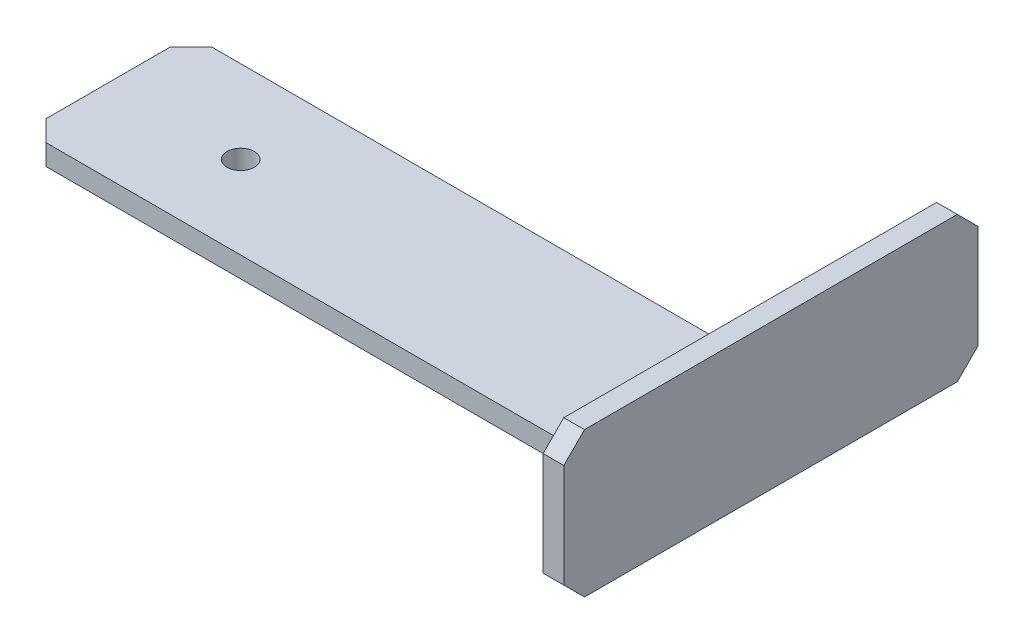
ISO-10303-21;
HEADER;
FILE_DESCRIPTION(('STEP AP214'),'2;1');
FILE_NAME('part.step','',(''),(''),'','','');
FILE_SCHEMA(('AUTOMOTIVE_DESIGN { 1 0 10303 214 1 1 1 1 }'));
ENDSEC;
DATA;
#1=APPLICATION_CONTEXT('core data for automotive mechanical design processes');
#2=APPLICATION_PROTOCOL_DEFINITION('international standard','automotive_design',2000,#1);
#3=PRODUCT_CONTEXT('',#1,'mechanical');
#4=PRODUCT('Part','Part','',(#3));
#5=PRODUCT_RELATED_PRODUCT_CATEGORY('part','',(#4));
#6=PRODUCT_DEFINITION_FORMATION('','',#4);
#7=PRODUCT_DEFINITION_CONTEXT('part definition',#1,'design');
#8=PRODUCT_DEFINITION('design','',#6,#7);
#9=PRODUCT_DEFINITION_SHAPE('','',#8);
#10=(LENGTH_UNIT() NAMED_UNIT(*) SI_UNIT(.MILLI.,.METRE.));
#11=(NAMED_UNIT(*) PLANE_ANGLE_UNIT() SI_UNIT($,.RADIAN.));
#12=(NAMED_UNIT(*) SI_UNIT($,.STERADIAN.) SOLID_ANGLE_UNIT());
#13=UNCERTAINTY_MEASURE_WITH_UNIT(LENGTH_MEASURE(1.E-05),#10,'distance_accuracy_value','');
#14=(GEOMETRIC_REPRESENTATION_CONTEXT(3) GLOBAL_UNCERTAINTY_ASSIGNED_CONTEXT((#13)) GLOBAL_UNIT_ASSIGNED_CONTEXT((#10,
#11,#12)) REPRESENTATION_CONTEXT('',''));
#15=CARTESIAN_POINT('',(0.,0.,0.));
#16=DIRECTION('',(0.,0.,1.));
#17=DIRECTION('',(1.,0.,0.));
#18=AXIS2_PLACEMENT_3D('',#15,#16,#17);
#19=CARTESIAN_POINT('',(0.,5.,0.));
#20=DIRECTION('',(0.,-1.,0.));
#21=DIRECTION('',(0.,0.,-1.));
#22=AXIS2_PLACEMENT_3D('',#19,#20,#21);
#23=PLANE('',#22);
#24=DIRECTION('',(-1.,0.,0.));
#25=VECTOR('',#24,1.);
#26=CARTESIAN_POINT('',(0.,5.,-40.));
#27=LINE('',#26,#25);
#28=CARTESIAN_POINT('',(150.,5.,-40.));
#29=VERTEX_POINT('',#28);
#30=CARTESIAN_POINT('',(5.00000000000006,5.,-40.));
#31=VERTEX_POINT('',#30);
#32=EDGE_CURVE('E173',#29,#31,#27,.T.);
#33=ORIENTED_EDGE('',*,*,#32,.T.);
#34=DIRECTION('',(0.707106781186549,0.,-0.707106781186546));
#35=VECTOR('',#34,1.);
#36=CARTESIAN_POINT('',(0.,5.,-35.));
#37=LINE('',#36,#35);
#38=CARTESIAN_POINT('',(0.,5.,-35.));
#39=VERTEX_POINT('',#38);
#40=EDGE_CURVE('E239',#31,#39,#37,.F.);
#41=ORIENTED_EDGE('',*,*,#40,.T.);
#42=DIRECTION('',(0.,0.,1.));
#43=VECTOR('',#42,1.);
#44=CARTESIAN_POINT('',(0.,5.,0.));
#45=LINE('',#44,#43);
#46=CARTESIAN_POINT('',(0.,5.,-5.00000000000003));
#47=VERTEX_POINT('',#46);
#48=EDGE_CURVE('E181',#39,#47,#45,.T.);
#49=ORIENTED_EDGE('',*,*,#48,.T.);
#50=DIRECTION('',(-0.707106781186548,0.,-0.707106781186548));
#51=VECTOR('',#50,1.);
#52=CARTESIAN_POINT('',(5.00000000000003,5.,0.));
#53=LINE('',#52,#51);
#54=CARTESIAN_POINT('',(5.00000000000003,5.,0.));
#55=VERTEX_POINT('',#54);
#56=EDGE_CURVE('E63',#47,#55,#53,.F.);
#57=ORIENTED_EDGE('',*,*,#56,.T.);
#58=DIRECTION('',(1.,0.,0.));
#59=VECTOR('',#58,1.);
#60=CARTESIAN_POINT('',(0.,5.,0.));
#61=LINE('',#60,#59);
#62=CARTESIAN_POINT('',(150.,5.,0.));
#63=VERTEX_POINT('',#62);
#64=EDGE_CURVE('E184',#55,#63,#61,.T.);
#65=ORIENTED_EDGE('',*,*,#64,.T.);
#66=DIRECTION('',(0.707106781186553,0.,0.707106781186542));
#67=VECTOR('',#66,1.);
#68=CARTESIAN_POINT('',(74.9999999999987,5.,-75.));
#69=LINE('',#68,#67);
#70=CARTESIAN_POINT('',(155.,5.,4.99999999999998));
#71=VERTEX_POINT('',#70);
#72=EDGE_CURVE('E55',#63,#71,#69,.T.);
#73=ORIENTED_EDGE('',*,*,#72,.T.);
#74=DIRECTION('',(0.,0.,-1.));
#75=VECTOR('',#74,1.);
#76=CARTESIAN_POINT('',(155.,5.,0.));
#77=LINE('',#76,#75);
#78=CARTESIAN_POINT('',(155.,5.,-44.9999999999999));
#79=VERTEX_POINT('',#78);
#80=EDGE_CURVE('E348',#71,#79,#77,.T.);
#81=ORIENTED_EDGE('',*,*,#80,.T.);
#82=DIRECTION('',(-0.707106781186551,0.,0.707106781186544));
#83=VECTOR('',#82,1.);
#84=CARTESIAN_POINT('',(54.9999999999992,5.,54.9999999999998));
#85=LINE('',#84,#83);
#86=EDGE_CURVE('E11',#79,#29,#85,.T.);
#87=ORIENTED_EDGE('',*,*,#86,.T.);
#88=EDGE_LOOP('',(#33,#41,#49,#57,#65,#73,#81,#87));
#89=FACE_BOUND('',#88,.T.);
#90=CARTESIAN_POINT('',(32.,5.,-20.));
#91=DIRECTION('',(0.,1.,0.));
#92=DIRECTION('',(0.,0.,1.));
#93=AXIS2_PLACEMENT_3D('',#90,#91,#92);
#94=CIRCLE('',#93,3.302);
#95=CARTESIAN_POINT('',(32.,5.,-16.698));
#96=VERTEX_POINT('',#95);
#97=EDGE_CURVE('E339',#96,#96,#94,.T.);
#98=ORIENTED_EDGE('',*,*,#97,.F.);
#99=EDGE_LOOP('',(#98));
#100=FACE_BOUND('',#99,.T.);
#101=ADVANCED_FACE('F39',(#89,#100),#23,.F.);
#102=CARTESIAN_POINT('',(0.,0.,0.));
#103=DIRECTION('',(0.,-1.,0.));
#104=DIRECTION('',(0.,0.,-1.));
#105=AXIS2_PLACEMENT_3D('',#102,#103,#104);
#106=PLANE('',#105);
#107=DIRECTION('',(0.,0.,-1.));
#108=VECTOR('',#107,1.);
#109=CARTESIAN_POINT('',(155.,0.,-70.));
#110=LINE('',#109,#108);
#111=CARTESIAN_POINT('',(155.,0.,-44.9999999999999));
#112=VERTEX_POINT('',#111);
#113=CARTESIAN_POINT('',(155.,0.,-65.));
#114=VERTEX_POINT('',#113);
#115=EDGE_CURVE('E366',#112,#114,#110,.T.);
#116=ORIENTED_EDGE('',*,*,#115,.T.);
#117=DIRECTION('',(1.,0.,0.));
#118=VECTOR('',#117,1.);
#119=CARTESIAN_POINT('',(0.,0.,-65.));
#120=LINE('',#119,#118);
#121=CARTESIAN_POINT('',(160.,0.,-65.));
#122=VERTEX_POINT('',#121);
#123=EDGE_CURVE('E197',#114,#122,#120,.T.);
#124=ORIENTED_EDGE('',*,*,#123,.T.);
#125=DIRECTION('',(0.,0.,-1.));
#126=VECTOR('',#125,1.);
#127=CARTESIAN_POINT('',(160.,0.,0.));
#128=LINE('',#127,#126);
#129=CARTESIAN_POINT('',(160.,0.,25.));
#130=VERTEX_POINT('',#129);
#131=EDGE_CURVE('E182',#130,#122,#128,.T.);
#132=ORIENTED_EDGE('',*,*,#131,.F.);
#133=DIRECTION('',(-1.,0.,0.));
#134=VECTOR('',#133,1.);
#135=CARTESIAN_POINT('',(0.,0.,25.));
#136=LINE('',#135,#134);
#137=CARTESIAN_POINT('',(155.,0.,25.));
#138=VERTEX_POINT('',#137);
#139=EDGE_CURVE('E194',#130,#138,#136,.T.);
#140=ORIENTED_EDGE('',*,*,#139,.T.);
#141=CARTESIAN_POINT('',(155.,0.,4.99999999999998));
#142=VERTEX_POINT('',#141);
#143=EDGE_CURVE('E252',#138,#142,#110,.T.);
#144=ORIENTED_EDGE('',*,*,#143,.T.);
#145=DIRECTION('',(-0.707106781186553,0.,-0.707106781186542));
#146=VECTOR('',#145,1.);
#147=CARTESIAN_POINT('',(150.,0.,0.));
#148=LINE('',#147,#146);
#149=CARTESIAN_POINT('',(150.,0.,0.));
#150=VERTEX_POINT('',#149);
#151=EDGE_CURVE('E165',#142,#150,#148,.T.);
#152=ORIENTED_EDGE('',*,*,#151,.T.);
#153=DIRECTION('',(1.,0.,0.));
#154=VECTOR('',#153,1.);
#155=CARTESIAN_POINT('',(0.,0.,0.));
#156=LINE('',#155,#154);
#157=CARTESIAN_POINT('',(5.00000000000003,0.,0.));
#158=VERTEX_POINT('',#157);
#159=EDGE_CURVE('E187',#158,#150,#156,.T.);
#160=ORIENTED_EDGE('',*,*,#159,.F.);
#161=DIRECTION('',(0.707106781186548,0.,0.707106781186548));
#162=VECTOR('',#161,1.);
#163=CARTESIAN_POINT('',(2.50000000000002,0.,-2.50000000000002));
#164=LINE('',#163,#162);
#165=CARTESIAN_POINT('',(0.,0.,-5.00000000000003));
#166=VERTEX_POINT('',#165);
#167=EDGE_CURVE('E191',#158,#166,#164,.F.);
#168=ORIENTED_EDGE('',*,*,#167,.T.);
#169=DIRECTION('',(0.,0.,1.));
#170=VECTOR('',#169,1.);
#171=CARTESIAN_POINT('',(0.,0.,0.));
#172=LINE('',#171,#170);
#173=CARTESIAN_POINT('',(0.,0.,-35.));
#174=VERTEX_POINT('',#173);
#175=EDGE_CURVE('E256',#174,#166,#172,.T.);
#176=ORIENTED_EDGE('',*,*,#175,.F.);
#177=DIRECTION('',(-0.707106781186549,0.,0.707106781186546));
#178=VECTOR('',#177,1.);
#179=CARTESIAN_POINT('',(-17.5,0.,-17.5000000000001));
#180=LINE('',#179,#178);
#181=CARTESIAN_POINT('',(5.00000000000006,0.,-40.));
#182=VERTEX_POINT('',#181);
#183=EDGE_CURVE('E180',#174,#182,#180,.F.);
#184=ORIENTED_EDGE('',*,*,#183,.T.);
#185=DIRECTION('',(-1.,0.,0.));
#186=VECTOR('',#185,1.);
#187=CARTESIAN_POINT('',(0.,0.,-40.));
#188=LINE('',#187,#186);
#189=CARTESIAN_POINT('',(150.,0.,-40.));
#190=VERTEX_POINT('',#189);
#191=EDGE_CURVE('E170',#190,#182,#188,.T.);
#192=ORIENTED_EDGE('',*,*,#191,.F.);
#193=DIRECTION('',(0.707106781186551,0.,-0.707106781186544));
#194=VECTOR('',#193,1.);
#195=CARTESIAN_POINT('',(150.,0.,-40.));
#196=LINE('',#195,#194);
#197=EDGE_CURVE('E48',#190,#112,#196,.T.);
#198=ORIENTED_EDGE('',*,*,#197,.T.);
#199=EDGE_LOOP('',(#116,#124,#132,#140,#144,#152,#160,#168,#176,#184,#192,#198));
#200=FACE_BOUND('',#199,.T.);
#201=CARTESIAN_POINT('',(32.,0.,-20.));
#202=DIRECTION('',(0.,1.,0.));
#203=DIRECTION('',(0.,0.,1.));
#204=AXIS2_PLACEMENT_3D('',#201,#202,#203);
#205=CIRCLE('',#204,3.302);
#206=CARTESIAN_POINT('',(32.,0.,-16.698));
#207=VERTEX_POINT('',#206);
#208=EDGE_CURVE('E342',#207,#207,#205,.T.);
#209=ORIENTED_EDGE('',*,*,#208,.T.);
#210=EDGE_LOOP('',(#209));
#211=FACE_BOUND('',#210,.T.);
#212=ADVANCED_FACE('F177',(#200,#211),#106,.T.);
#213=CARTESIAN_POINT('',(0.,5.,0.));
#214=DIRECTION('',(1.,0.,0.));
#215=DIRECTION('',(0.,0.,-1.));
#216=AXIS2_PLACEMENT_3D('',#213,#214,#215);
#217=PLANE('',#216);
#218=ORIENTED_EDGE('',*,*,#48,.F.);
#219=DIRECTION('',(0.,-1.,0.));
#220=VECTOR('',#219,1.);
#221=CARTESIAN_POINT('',(0.,5.,-35.));
#222=LINE('',#221,#220);
#223=EDGE_CURVE('E175',#39,#174,#222,.T.);
#224=ORIENTED_EDGE('',*,*,#223,.T.);
#225=ORIENTED_EDGE('',*,*,#175,.T.);
#226=DIRECTION('',(0.,1.,0.));
#227=VECTOR('',#226,1.);
#228=CARTESIAN_POINT('',(0.,5.,-5.00000000000003));
#229=LINE('',#228,#227);
#230=EDGE_CURVE('E233',#166,#47,#229,.T.);
#231=ORIENTED_EDGE('',*,*,#230,.T.);
#232=EDGE_LOOP('',(#218,#224,#225,#231));
#233=FACE_BOUND('',#232,.T.);
#234=ADVANCED_FACE('F273',(#233),#217,.F.);
#235=CARTESIAN_POINT('',(0.,5.,0.));
#236=DIRECTION('',(0.,0.,-1.));
#237=DIRECTION('',(-1.,0.,0.));
#238=AXIS2_PLACEMENT_3D('',#235,#236,#237);
#239=PLANE('',#238);
#240=ORIENTED_EDGE('',*,*,#64,.F.);
#241=DIRECTION('',(0.,-1.,0.));
#242=VECTOR('',#241,1.);
#243=CARTESIAN_POINT('',(5.00000000000003,5.,0.));
#244=LINE('',#243,#242);
#245=EDGE_CURVE('E243',#55,#158,#244,.T.);
#246=ORIENTED_EDGE('',*,*,#245,.T.);
#247=ORIENTED_EDGE('',*,*,#159,.T.);
#248=DIRECTION('',(0.,1.,0.));
#249=VECTOR('',#248,1.);
#250=CARTESIAN_POINT('',(150.,5.,0.));
#251=LINE('',#250,#249);
#252=EDGE_CURVE('E241',#150,#63,#251,.T.);
#253=ORIENTED_EDGE('',*,*,#252,.T.);
#254=EDGE_LOOP('',(#240,#246,#247,#253));
#255=FACE_BOUND('',#254,.T.);
#256=ADVANCED_FACE('F254',(#255),#239,.F.);
#257=CARTESIAN_POINT('',(160.,5.,0.));
#258=DIRECTION('',(-1.,0.,0.));
#259=DIRECTION('',(0.,0.,1.));
#260=AXIS2_PLACEMENT_3D('',#257,#258,#259);
#261=PLANE('',#260);
#262=ORIENTED_EDGE('',*,*,#131,.T.);
#263=DIRECTION('',(0.,-0.707106781186548,0.707106781186548));
#264=VECTOR('',#263,1.);
#265=CARTESIAN_POINT('',(160.,0.,-65.));
#266=LINE('',#265,#264);
#267=CARTESIAN_POINT('',(160.,5.,-70.));
#268=VERTEX_POINT('',#267);
#269=EDGE_CURVE('E206',#122,#268,#266,.F.);
#270=ORIENTED_EDGE('',*,*,#269,.T.);
#271=DIRECTION('',(0.,-1.,0.));
#272=VECTOR('',#271,1.);
#273=CARTESIAN_POINT('',(160.,35.,-70.));
#274=LINE('',#273,#272);
#275=CARTESIAN_POINT('',(160.,30.,-70.));
#276=VERTEX_POINT('',#275);
#277=EDGE_CURVE('E355',#276,#268,#274,.T.);
#278=ORIENTED_EDGE('',*,*,#277,.F.);
#279=DIRECTION('',(0.,-0.707106781186546,-0.707106781186549));
#280=VECTOR('',#279,1.);
#281=CARTESIAN_POINT('',(160.,30.,-70.));
#282=LINE('',#281,#280);
#283=CARTESIAN_POINT('',(160.,35.,-64.9999999999999));
#284=VERTEX_POINT('',#283);
#285=EDGE_CURVE('E200',#276,#284,#282,.F.);
#286=ORIENTED_EDGE('',*,*,#285,.T.);
#287=DIRECTION('',(0.,0.,1.));
#288=VECTOR('',#287,1.);
#289=CARTESIAN_POINT('',(160.,35.,-70.));
#290=LINE('',#289,#288);
#291=CARTESIAN_POINT('',(160.,35.,24.9999999999999));
#292=VERTEX_POINT('',#291);
#293=EDGE_CURVE('E356',#284,#292,#290,.T.);
#294=ORIENTED_EDGE('',*,*,#293,.T.);
#295=DIRECTION('',(0.,0.707106781186546,-0.707106781186549));
#296=VECTOR('',#295,1.);
#297=CARTESIAN_POINT('',(160.,30.,30.));
#298=LINE('',#297,#296);
#299=CARTESIAN_POINT('',(160.,30.,30.));
#300=VERTEX_POINT('',#299);
#301=EDGE_CURVE('E202',#292,#300,#298,.F.);
#302=ORIENTED_EDGE('',*,*,#301,.T.);
#303=DIRECTION('',(0.,-1.,0.));
#304=VECTOR('',#303,1.);
#305=CARTESIAN_POINT('',(160.,35.,30.));
#306=LINE('',#305,#304);
#307=CARTESIAN_POINT('',(160.,5.00000000000003,30.));
#308=VERTEX_POINT('',#307);
#309=EDGE_CURVE('E359',#300,#308,#306,.T.);
#310=ORIENTED_EDGE('',*,*,#309,.T.);
#311=DIRECTION('',(0.,0.707106781186548,0.707106781186548));
#312=VECTOR('',#311,1.);
#313=CARTESIAN_POINT('',(160.,0.,25.));
#314=LINE('',#313,#312);
#315=EDGE_CURVE('E204',#308,#130,#314,.F.);
#316=ORIENTED_EDGE('',*,*,#315,.T.);
#317=EDGE_LOOP('',(#262,#270,#278,#286,#294,#302,#310,#316));
#318=FACE_BOUND('',#317,.T.);
#319=ADVANCED_FACE('F282',(#318),#261,.F.);
#320=CARTESIAN_POINT('',(0.,5.,-40.));
#321=DIRECTION('',(0.,0.,1.));
#322=DIRECTION('',(1.,0.,0.));
#323=AXIS2_PLACEMENT_3D('',#320,#321,#322);
#324=PLANE('',#323);
#325=ORIENTED_EDGE('',*,*,#191,.T.);
#326=DIRECTION('',(0.,1.,0.));
#327=VECTOR('',#326,1.);
#328=CARTESIAN_POINT('',(5.00000000000006,5.,-40.));
#329=LINE('',#328,#327);
#330=EDGE_CURVE('E174',#182,#31,#329,.T.);
#331=ORIENTED_EDGE('',*,*,#330,.T.);
#332=ORIENTED_EDGE('',*,*,#32,.F.);
#333=DIRECTION('',(0.,-1.,0.));
#334=VECTOR('',#333,1.);
#335=CARTESIAN_POINT('',(150.,5.,-40.));
#336=LINE('',#335,#334);
#337=EDGE_CURVE('E158',#29,#190,#336,.T.);
#338=ORIENTED_EDGE('',*,*,#337,.T.);
#339=EDGE_LOOP('',(#325,#331,#332,#338));
#340=FACE_BOUND('',#339,.T.);
#341=ADVANCED_FACE('F169',(#340),#324,.F.);
#342=CARTESIAN_POINT('',(32.,5.,-20.));
#343=DIRECTION('',(0.,-1.,0.));
#344=DIRECTION('',(0.,0.,-1.));
#345=AXIS2_PLACEMENT_3D('',#342,#343,#344);
#346=CYLINDRICAL_SURFACE('',#345,3.302);
#347=ORIENTED_EDGE('',*,*,#97,.T.);
#348=EDGE_LOOP('',(#347));
#349=FACE_BOUND('',#348,.T.);
#350=ORIENTED_EDGE('',*,*,#208,.F.);
#351=EDGE_LOOP('',(#350));
#352=FACE_BOUND('',#351,.T.);
#353=ADVANCED_FACE('F277',(#349,#352),#346,.F.);
#354=CARTESIAN_POINT('',(155.,35.,-70.));
#355=DIRECTION('',(-1.,0.,0.));
#356=DIRECTION('',(0.,0.,1.));
#357=AXIS2_PLACEMENT_3D('',#354,#355,#356);
#358=PLANE('',#357);
#359=DIRECTION('',(0.,-1.,0.));
#360=VECTOR('',#359,1.);
#361=CARTESIAN_POINT('',(155.,35.,-70.));
#362=LINE('',#361,#360);
#363=CARTESIAN_POINT('',(155.,30.,-70.));
#364=VERTEX_POINT('',#363);
#365=CARTESIAN_POINT('',(155.,5.,-70.));
#366=VERTEX_POINT('',#365);
#367=EDGE_CURVE('E352',#364,#366,#362,.T.);
#368=ORIENTED_EDGE('',*,*,#367,.T.);
#369=DIRECTION('',(0.,0.707106781186548,-0.707106781186548));
#370=VECTOR('',#369,1.);
#371=CARTESIAN_POINT('',(155.,20.,-85.));
#372=LINE('',#371,#370);
#373=EDGE_CURVE('E222',#366,#114,#372,.F.);
#374=ORIENTED_EDGE('',*,*,#373,.T.);
#375=ORIENTED_EDGE('',*,*,#115,.F.);
#376=DIRECTION('',(0.,1.,0.));
#377=VECTOR('',#376,1.);
#378=CARTESIAN_POINT('',(155.,35.,-44.9999999999999));
#379=LINE('',#378,#377);
#380=EDGE_CURVE('E160',#112,#79,#379,.T.);
#381=ORIENTED_EDGE('',*,*,#380,.T.);
#382=ORIENTED_EDGE('',*,*,#80,.F.);
#383=DIRECTION('',(0.,-1.,0.));
#384=VECTOR('',#383,1.);
#385=CARTESIAN_POINT('',(155.,35.,4.99999999999998));
#386=LINE('',#385,#384);
#387=EDGE_CURVE('E214',#71,#142,#386,.T.);
#388=ORIENTED_EDGE('',*,*,#387,.T.);
#389=ORIENTED_EDGE('',*,*,#143,.F.);
#390=DIRECTION('',(0.,-0.707106781186548,-0.707106781186548));
#391=VECTOR('',#390,1.);
#392=CARTESIAN_POINT('',(155.,-30.,-5.00000000000003));
#393=LINE('',#392,#391);
#394=CARTESIAN_POINT('',(155.,5.00000000000003,30.));
#395=VERTEX_POINT('',#394);
#396=EDGE_CURVE('E220',#138,#395,#393,.F.);
#397=ORIENTED_EDGE('',*,*,#396,.T.);
#398=DIRECTION('',(0.,-1.,0.));
#399=VECTOR('',#398,1.);
#400=CARTESIAN_POINT('',(155.,35.,30.));
#401=LINE('',#400,#399);
#402=CARTESIAN_POINT('',(155.,30.,30.));
#403=VERTEX_POINT('',#402);
#404=EDGE_CURVE('E351',#403,#395,#401,.T.);
#405=ORIENTED_EDGE('',*,*,#404,.F.);
#406=DIRECTION('',(0.,-0.707106781186546,0.707106781186549));
#407=VECTOR('',#406,1.);
#408=CARTESIAN_POINT('',(155.,82.5,-22.5000000000003));
#409=LINE('',#408,#407);
#410=CARTESIAN_POINT('',(155.,35.,24.9999999999999));
#411=VERTEX_POINT('',#410);
#412=EDGE_CURVE('E218',#403,#411,#409,.F.);
#413=ORIENTED_EDGE('',*,*,#412,.T.);
#414=DIRECTION('',(0.,0.,-1.));
#415=VECTOR('',#414,1.);
#416=CARTESIAN_POINT('',(155.,35.,-70.));
#417=LINE('',#416,#415);
#418=CARTESIAN_POINT('',(155.,35.,-64.9999999999999));
#419=VERTEX_POINT('',#418);
#420=EDGE_CURVE('E365',#411,#419,#417,.T.);
#421=ORIENTED_EDGE('',*,*,#420,.T.);
#422=DIRECTION('',(0.,0.707106781186546,0.707106781186549));
#423=VECTOR('',#422,1.);
#424=CARTESIAN_POINT('',(155.,32.5,-67.5));
#425=LINE('',#424,#423);
#426=EDGE_CURVE('E216',#419,#364,#425,.F.);
#427=ORIENTED_EDGE('',*,*,#426,.T.);
#428=EDGE_LOOP('',(#368,#374,#375,#381,#382,#388,#389,#397,#405,#413,#421,#427));
#429=FACE_BOUND('',#428,.T.);
#430=ADVANCED_FACE('F373',(#429),#358,.T.);
#431=CARTESIAN_POINT('',(155.,35.,30.));
#432=DIRECTION('',(0.,0.,1.));
#433=DIRECTION('',(1.,0.,0.));
#434=AXIS2_PLACEMENT_3D('',#431,#432,#433);
#435=PLANE('',#434);
#436=ORIENTED_EDGE('',*,*,#404,.T.);
#437=DIRECTION('',(1.,0.,0.));
#438=VECTOR('',#437,1.);
#439=CARTESIAN_POINT('',(155.,5.00000000000003,30.));
#440=LINE('',#439,#438);
#441=EDGE_CURVE('E227',#395,#308,#440,.T.);
#442=ORIENTED_EDGE('',*,*,#441,.T.);
#443=ORIENTED_EDGE('',*,*,#309,.F.);
#444=DIRECTION('',(-1.,0.,0.));
#445=VECTOR('',#444,1.);
#446=CARTESIAN_POINT('',(155.,30.,30.));
#447=LINE('',#446,#445);
#448=EDGE_CURVE('E224',#300,#403,#447,.T.);
#449=ORIENTED_EDGE('',*,*,#448,.T.);
#450=EDGE_LOOP('',(#436,#442,#443,#449));
#451=FACE_BOUND('',#450,.T.);
#452=ADVANCED_FACE('F391',(#451),#435,.T.);
#453=CARTESIAN_POINT('',(155.,35.,-70.));
#454=DIRECTION('',(0.,0.,-1.));
#455=DIRECTION('',(-1.,0.,0.));
#456=AXIS2_PLACEMENT_3D('',#453,#454,#455);
#457=PLANE('',#456);
#458=ORIENTED_EDGE('',*,*,#277,.T.);
#459=DIRECTION('',(-1.,0.,0.));
#460=VECTOR('',#459,1.);
#461=CARTESIAN_POINT('',(155.,5.,-70.));
#462=LINE('',#461,#460);
#463=EDGE_CURVE('E211',#268,#366,#462,.T.);
#464=ORIENTED_EDGE('',*,*,#463,.T.);
#465=ORIENTED_EDGE('',*,*,#367,.F.);
#466=DIRECTION('',(1.,0.,0.));
#467=VECTOR('',#466,1.);
#468=CARTESIAN_POINT('',(155.,30.,-70.));
#469=LINE('',#468,#467);
#470=EDGE_CURVE('E208',#364,#276,#469,.T.);
#471=ORIENTED_EDGE('',*,*,#470,.T.);
#472=EDGE_LOOP('',(#458,#464,#465,#471));
#473=FACE_BOUND('',#472,.T.);
#474=ADVANCED_FACE('F382',(#473),#457,.T.);
#475=CARTESIAN_POINT('',(0.,35.,0.));
#476=DIRECTION('',(0.,1.,0.));
#477=DIRECTION('',(0.,0.,1.));
#478=AXIS2_PLACEMENT_3D('',#475,#476,#477);
#479=PLANE('',#478);
#480=ORIENTED_EDGE('',*,*,#420,.F.);
#481=DIRECTION('',(1.,0.,0.));
#482=VECTOR('',#481,1.);
#483=CARTESIAN_POINT('',(0.,35.,24.9999999999999));
#484=LINE('',#483,#482);
#485=EDGE_CURVE('E231',#411,#292,#484,.T.);
#486=ORIENTED_EDGE('',*,*,#485,.T.);
#487=ORIENTED_EDGE('',*,*,#293,.F.);
#488=DIRECTION('',(-1.,0.,0.));
#489=VECTOR('',#488,1.);
#490=CARTESIAN_POINT('',(0.,35.,-64.9999999999999));
#491=LINE('',#490,#489);
#492=EDGE_CURVE('E229',#284,#419,#491,.T.);
#493=ORIENTED_EDGE('',*,*,#492,.T.);
#494=EDGE_LOOP('',(#480,#486,#487,#493));
#495=FACE_BOUND('',#494,.T.);
#496=ADVANCED_FACE('F299',(#495),#479,.T.);
#497=CARTESIAN_POINT('',(0.,0.,-65.));
#498=DIRECTION('',(0.,0.707106781186547,0.707106781186547));
#499=DIRECTION('',(1.,0.,0.));
#500=AXIS2_PLACEMENT_3D('',#497,#498,#499);
#501=PLANE('',#500);
#502=ORIENTED_EDGE('',*,*,#373,.F.);
#503=ORIENTED_EDGE('',*,*,#463,.F.);
#504=ORIENTED_EDGE('',*,*,#269,.F.);
#505=ORIENTED_EDGE('',*,*,#123,.F.);
#506=EDGE_LOOP('',(#502,#503,#504,#505));
#507=FACE_BOUND('',#506,.T.);
#508=ADVANCED_FACE('F292',(#507),#501,.F.);
#509=CARTESIAN_POINT('',(0.,0.,25.));
#510=DIRECTION('',(0.,0.707106781186547,-0.707106781186547));
#511=DIRECTION('',(-1.,0.,0.));
#512=AXIS2_PLACEMENT_3D('',#509,#510,#511);
#513=PLANE('',#512);
#514=ORIENTED_EDGE('',*,*,#315,.F.);
#515=ORIENTED_EDGE('',*,*,#441,.F.);
#516=ORIENTED_EDGE('',*,*,#396,.F.);
#517=ORIENTED_EDGE('',*,*,#139,.F.);
#518=EDGE_LOOP('',(#514,#515,#516,#517));
#519=FACE_BOUND('',#518,.T.);
#520=ADVANCED_FACE('F298',(#519),#513,.F.);
#521=CARTESIAN_POINT('',(155.,30.,30.));
#522=DIRECTION('',(0.,-0.707106781186549,-0.707106781186546));
#523=DIRECTION('',(-1.,0.,0.));
#524=AXIS2_PLACEMENT_3D('',#521,#522,#523);
#525=PLANE('',#524);
#526=ORIENTED_EDGE('',*,*,#301,.F.);
#527=ORIENTED_EDGE('',*,*,#485,.F.);
#528=ORIENTED_EDGE('',*,*,#412,.F.);
#529=ORIENTED_EDGE('',*,*,#448,.F.);
#530=EDGE_LOOP('',(#526,#527,#528,#529));
#531=FACE_BOUND('',#530,.T.);
#532=ADVANCED_FACE('F306',(#531),#525,.F.);
#533=CARTESIAN_POINT('',(155.,30.,-70.));
#534=DIRECTION('',(0.,-0.707106781186549,0.707106781186546));
#535=DIRECTION('',(1.,0.,0.));
#536=AXIS2_PLACEMENT_3D('',#533,#534,#535);
#537=PLANE('',#536);
#538=ORIENTED_EDGE('',*,*,#426,.F.);
#539=ORIENTED_EDGE('',*,*,#492,.F.);
#540=ORIENTED_EDGE('',*,*,#285,.F.);
#541=ORIENTED_EDGE('',*,*,#470,.F.);
#542=EDGE_LOOP('',(#538,#539,#540,#541));
#543=FACE_BOUND('',#542,.T.);
#544=ADVANCED_FACE('F313',(#543),#537,.F.);
#545=CARTESIAN_POINT('',(0.,5.,-35.));
#546=DIRECTION('',(0.707106781186546,0.,0.707106781186549));
#547=DIRECTION('',(0.,-1.,0.));
#548=AXIS2_PLACEMENT_3D('',#545,#546,#547);
#549=PLANE('',#548);
#550=ORIENTED_EDGE('',*,*,#40,.F.);
#551=ORIENTED_EDGE('',*,*,#330,.F.);
#552=ORIENTED_EDGE('',*,*,#183,.F.);
#553=ORIENTED_EDGE('',*,*,#223,.F.);
#554=EDGE_LOOP('',(#550,#551,#552,#553));
#555=FACE_BOUND('',#554,.T.);
#556=ADVANCED_FACE('F264',(#555),#549,.F.);
#557=CARTESIAN_POINT('',(5.00000000000003,5.,0.));
#558=DIRECTION('',(0.707106781186547,0.,-0.707106781186547));
#559=DIRECTION('',(0.,-1.,0.));
#560=AXIS2_PLACEMENT_3D('',#557,#558,#559);
#561=PLANE('',#560);
#562=ORIENTED_EDGE('',*,*,#56,.F.);
#563=ORIENTED_EDGE('',*,*,#230,.F.);
#564=ORIENTED_EDGE('',*,*,#167,.F.);
#565=ORIENTED_EDGE('',*,*,#245,.F.);
#566=EDGE_LOOP('',(#562,#563,#564,#565));
#567=FACE_BOUND('',#566,.T.);
#568=ADVANCED_FACE('F259',(#567),#561,.F.);
#569=CARTESIAN_POINT('',(150.,5.,0.));
#570=DIRECTION('',(0.707106781186542,0.,-0.707106781186553));
#571=DIRECTION('',(0.,1.,0.));
#572=AXIS2_PLACEMENT_3D('',#569,#570,#571);
#573=PLANE('',#572);
#574=ORIENTED_EDGE('',*,*,#151,.F.);
#575=ORIENTED_EDGE('',*,*,#387,.F.);
#576=ORIENTED_EDGE('',*,*,#72,.F.);
#577=ORIENTED_EDGE('',*,*,#252,.F.);
#578=EDGE_LOOP('',(#574,#575,#576,#577));
#579=FACE_BOUND('',#578,.T.);
#580=ADVANCED_FACE('F257',(#579),#573,.F.);
#581=CARTESIAN_POINT('',(150.,5.,-40.));
#582=DIRECTION('',(0.707106781186544,0.,0.707106781186551));
#583=DIRECTION('',(0.,-1.,0.));
#584=AXIS2_PLACEMENT_3D('',#581,#582,#583);
#585=PLANE('',#584);
#586=ORIENTED_EDGE('',*,*,#86,.F.);
#587=ORIENTED_EDGE('',*,*,#380,.F.);
#588=ORIENTED_EDGE('',*,*,#197,.F.);
#589=ORIENTED_EDGE('',*,*,#337,.F.);
#590=EDGE_LOOP('',(#586,#587,#588,#589));
#591=FACE_BOUND('',#590,.T.);
#592=ADVANCED_FACE('F42',(#591),#585,.F.);
#593=CLOSED_SHELL('',(#101,#212,#234,#256,#319,#341,#353,#430,#452,#474,#496,#508,#520,#532,
#544,#556,#568,#580,#592));
#594=MANIFOLD_SOLID_BREP('B2',#593);
#595=ADVANCED_BREP_SHAPE_REPRESENTATION('',(#18,#594),#14);
#596=SHAPE_DEFINITION_REPRESENTATION(#9,#595);
ENDSEC;
END-ISO-10303-21;
